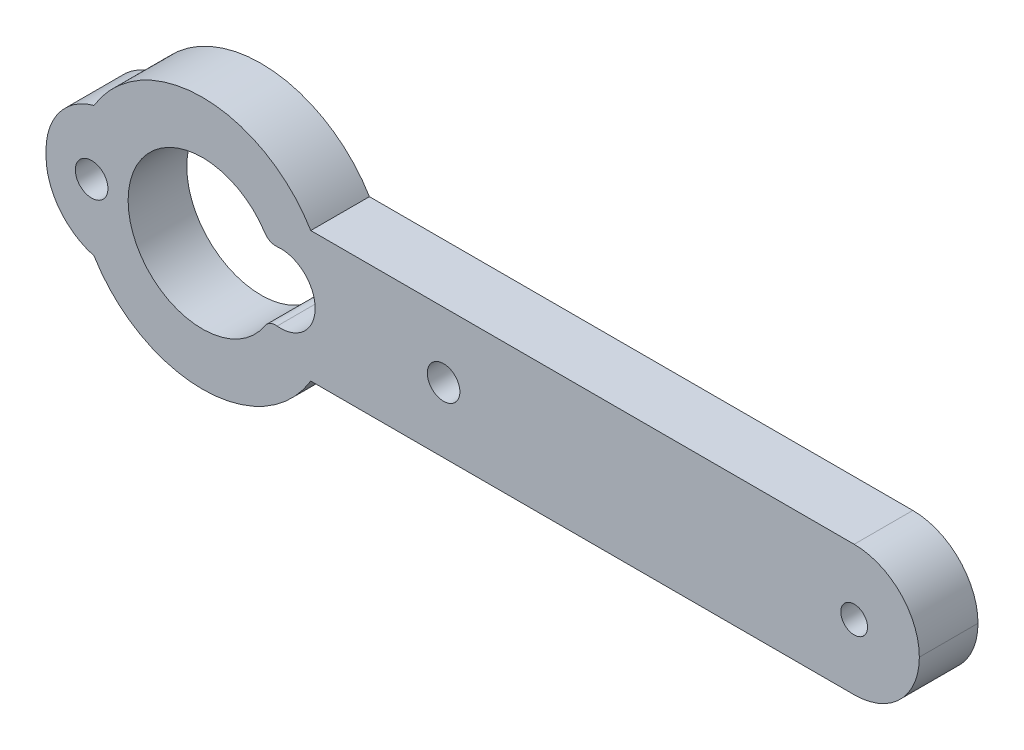
ISO-10303-21;
HEADER;
FILE_DESCRIPTION(('STEP AP214'),'2;1');
FILE_NAME('part.step','',(''),(''),'','','');
FILE_SCHEMA(('AUTOMOTIVE_DESIGN { 1 0 10303 214 1 1 1 1 }'));
ENDSEC;
DATA;
#1=APPLICATION_CONTEXT('core data for automotive mechanical design processes');
#2=APPLICATION_PROTOCOL_DEFINITION('international standard','automotive_design',2000,#1);
#3=PRODUCT_CONTEXT('',#1,'mechanical');
#4=PRODUCT('Part','Part','',(#3));
#5=PRODUCT_RELATED_PRODUCT_CATEGORY('part','',(#4));
#6=PRODUCT_DEFINITION_FORMATION('','',#4);
#7=PRODUCT_DEFINITION_CONTEXT('part definition',#1,'design');
#8=PRODUCT_DEFINITION('design','',#6,#7);
#9=PRODUCT_DEFINITION_SHAPE('','',#8);
#10=(LENGTH_UNIT() NAMED_UNIT(*) SI_UNIT(.MILLI.,.METRE.));
#11=(NAMED_UNIT(*) PLANE_ANGLE_UNIT() SI_UNIT($,.RADIAN.));
#12=(NAMED_UNIT(*) SI_UNIT($,.STERADIAN.) SOLID_ANGLE_UNIT());
#13=UNCERTAINTY_MEASURE_WITH_UNIT(LENGTH_MEASURE(1.E-05),#10,'distance_accuracy_value','');
#14=(GEOMETRIC_REPRESENTATION_CONTEXT(3) GLOBAL_UNCERTAINTY_ASSIGNED_CONTEXT((#13)) GLOBAL_UNIT_ASSIGNED_CONTEXT((#10,
#11,#12)) REPRESENTATION_CONTEXT('',''));
#15=CARTESIAN_POINT('',(0.,0.,0.));
#16=DIRECTION('',(0.,0.,1.));
#17=DIRECTION('',(1.,0.,0.));
#18=AXIS2_PLACEMENT_3D('',#15,#16,#17);
#19=CARTESIAN_POINT('',(-55.,-5.00000000000002,4.5));
#20=DIRECTION('',(0.,0.,1.));
#21=DIRECTION('',(1.,0.,0.));
#22=AXIS2_PLACEMENT_3D('',#19,#20,#21);
#23=PLANE('',#22);
#24=CARTESIAN_POINT('',(-63.5,-5.00000000000002,4.5));
#25=DIRECTION('',(0.,0.,1.));
#26=DIRECTION('',(1.,0.,0.));
#27=AXIS2_PLACEMENT_3D('',#24,#25,#26);
#28=CIRCLE('',#27,1.25);
#29=CARTESIAN_POINT('',(-62.25,-5.00000000000002,4.5));
#30=VERTEX_POINT('',#29);
#31=EDGE_CURVE('E302',#30,#30,#28,.T.);
#32=ORIENTED_EDGE('',*,*,#31,.F.);
#33=EDGE_LOOP('',(#32));
#34=FACE_BOUND('',#33,.T.);
#35=CARTESIAN_POINT('',(-55.,-5.00000000000002,4.5));
#36=DIRECTION('',(0.,0.,1.));
#37=DIRECTION('',(1.,0.,0.));
#38=AXIS2_PLACEMENT_3D('',#35,#36,#37);
#39=CIRCLE('',#38,9.7);
#40=CARTESIAN_POINT('',(-46.6879605390735,0.,4.5));
#41=VERTEX_POINT('',#40);
#42=CARTESIAN_POINT('',(-63.3120394609265,0.,4.5));
#43=VERTEX_POINT('',#42);
#44=EDGE_CURVE('E133',#41,#43,#39,.T.);
#45=ORIENTED_EDGE('',*,*,#44,.T.);
#46=CARTESIAN_POINT('',(-62.,-4.82478522350702,4.5));
#47=DIRECTION('',(0.,0.,1.));
#48=DIRECTION('',(1.,0.,0.));
#49=AXIS2_PLACEMENT_3D('',#46,#47,#48);
#50=CIRCLE('',#49,5.);
#51=CARTESIAN_POINT('',(-67.,-4.82478522350702,4.5));
#52=VERTEX_POINT('',#51);
#53=EDGE_CURVE('E11',#43,#52,#50,.T.);
#54=ORIENTED_EDGE('',*,*,#53,.T.);
#55=DIRECTION('',(0.,-1.,0.));
#56=VECTOR('',#55,1.);
#57=CARTESIAN_POINT('',(-67.,0.,4.5));
#58=LINE('',#57,#56);
#59=CARTESIAN_POINT('',(-67.,-5.17521477649301,4.5));
#60=VERTEX_POINT('',#59);
#61=EDGE_CURVE('E154',#52,#60,#58,.T.);
#62=ORIENTED_EDGE('',*,*,#61,.T.);
#63=CARTESIAN_POINT('',(-62.,-5.17521477649301,4.5));
#64=DIRECTION('',(0.,0.,1.));
#65=DIRECTION('',(1.,0.,0.));
#66=AXIS2_PLACEMENT_3D('',#63,#64,#65);
#67=CIRCLE('',#66,5.);
#68=CARTESIAN_POINT('',(-63.3120394609265,-10.,4.5));
#69=VERTEX_POINT('',#68);
#70=EDGE_CURVE('E45',#60,#69,#67,.T.);
#71=ORIENTED_EDGE('',*,*,#70,.T.);
#72=CARTESIAN_POINT('',(-55.,-5.00000000000002,4.5));
#73=DIRECTION('',(0.,0.,1.));
#74=DIRECTION('',(1.,0.,0.));
#75=AXIS2_PLACEMENT_3D('',#72,#73,#74);
#76=CIRCLE('',#75,9.7);
#77=CARTESIAN_POINT('',(-46.6879605390735,-10.,4.5));
#78=VERTEX_POINT('',#77);
#79=EDGE_CURVE('E156',#69,#78,#76,.T.);
#80=ORIENTED_EDGE('',*,*,#79,.T.);
#81=DIRECTION('',(1.,0.,0.));
#82=VECTOR('',#81,1.);
#83=CARTESIAN_POINT('',(0.,-10.,4.5));
#84=LINE('',#83,#82);
#85=CARTESIAN_POINT('',(-5.,-10.,4.5));
#86=VERTEX_POINT('',#85);
#87=EDGE_CURVE('E161',#78,#86,#84,.T.);
#88=ORIENTED_EDGE('',*,*,#87,.T.);
#89=CARTESIAN_POINT('',(-5.,-5.,4.5));
#90=DIRECTION('',(0.,0.,1.));
#91=DIRECTION('',(1.,0.,0.));
#92=AXIS2_PLACEMENT_3D('',#89,#90,#91);
#93=CIRCLE('',#92,5.);
#94=CARTESIAN_POINT('',(0.,-5.,4.5));
#95=VERTEX_POINT('',#94);
#96=EDGE_CURVE('E206',#86,#95,#93,.T.);
#97=ORIENTED_EDGE('',*,*,#96,.T.);
#98=CARTESIAN_POINT('',(-5.,-5.,4.5));
#99=DIRECTION('',(0.,0.,1.));
#100=DIRECTION('',(1.,0.,0.));
#101=AXIS2_PLACEMENT_3D('',#98,#99,#100);
#102=CIRCLE('',#101,5.);
#103=CARTESIAN_POINT('',(-5.,0.,4.5));
#104=VERTEX_POINT('',#103);
#105=EDGE_CURVE('E136',#95,#104,#102,.T.);
#106=ORIENTED_EDGE('',*,*,#105,.T.);
#107=DIRECTION('',(-1.,0.,0.));
#108=VECTOR('',#107,1.);
#109=CARTESIAN_POINT('',(0.,0.,4.5));
#110=LINE('',#109,#108);
#111=EDGE_CURVE('E129',#104,#41,#110,.T.);
#112=ORIENTED_EDGE('',*,*,#111,.T.);
#113=EDGE_LOOP('',(#45,#54,#62,#71,#80,#88,#97,#106,#112));
#114=FACE_BOUND('',#113,.T.);
#115=CARTESIAN_POINT('',(-5.,-5.00000000000001,4.5));
#116=DIRECTION('',(0.,0.,1.));
#117=DIRECTION('',(1.,0.,0.));
#118=AXIS2_PLACEMENT_3D('',#115,#116,#117);
#119=CIRCLE('',#118,1.025);
#120=CARTESIAN_POINT('',(-3.975,-5.00000000000001,4.5));
#121=VERTEX_POINT('',#120);
#122=EDGE_CURVE('E167',#121,#121,#119,.T.);
#123=ORIENTED_EDGE('',*,*,#122,.F.);
#124=EDGE_LOOP('',(#123));
#125=FACE_BOUND('',#124,.T.);
#126=CARTESIAN_POINT('',(-49.,-5.00000000000001,4.5));
#127=DIRECTION('',(0.,0.,1.));
#128=DIRECTION('',(1.,0.,0.));
#129=AXIS2_PLACEMENT_3D('',#126,#127,#128);
#130=CIRCLE('',#129,2.65);
#131=CARTESIAN_POINT('',(-49.268176369863,-7.63639553835291,4.5));
#132=VERTEX_POINT('',#131);
#133=CARTESIAN_POINT('',(-49.268176369863,-2.36360446164711,4.5));
#134=VERTEX_POINT('',#133);
#135=EDGE_CURVE('E308',#132,#134,#130,.T.);
#136=ORIENTED_EDGE('',*,*,#135,.F.);
#137=CARTESIAN_POINT('',(-49.369375,-8.6312617792408,4.5));
#138=DIRECTION('',(0.,0.,1.));
#139=DIRECTION('',(1.,0.,0.));
#140=AXIS2_PLACEMENT_3D('',#137,#138,#139);
#141=CIRCLE('',#140,1.);
#142=CARTESIAN_POINT('',(-50.2097667910448,-8.08928240920486,4.5));
#143=VERTEX_POINT('',#142);
#144=EDGE_CURVE('E196',#132,#143,#141,.T.);
#145=ORIENTED_EDGE('',*,*,#144,.T.);
#146=CARTESIAN_POINT('',(-55.,-5.00000000000002,4.5));
#147=DIRECTION('',(0.,0.,1.));
#148=DIRECTION('',(1.,0.,0.));
#149=AXIS2_PLACEMENT_3D('',#146,#147,#148);
#150=CIRCLE('',#149,5.7);
#151=CARTESIAN_POINT('',(-50.2097667910448,-1.91071759079516,4.5));
#152=VERTEX_POINT('',#151);
#153=EDGE_CURVE('E311',#152,#143,#150,.T.);
#154=ORIENTED_EDGE('',*,*,#153,.F.);
#155=CARTESIAN_POINT('',(-49.369375,-1.36873822075922,4.5));
#156=DIRECTION('',(0.,0.,1.));
#157=DIRECTION('',(1.,0.,0.));
#158=AXIS2_PLACEMENT_3D('',#155,#156,#157);
#159=CIRCLE('',#158,1.);
#160=EDGE_CURVE('E194',#152,#134,#159,.T.);
#161=ORIENTED_EDGE('',*,*,#160,.T.);
#162=EDGE_LOOP('',(#136,#145,#154,#161));
#163=FACE_BOUND('',#162,.T.);
#164=CARTESIAN_POINT('',(-36.5,-5.00000000000002,4.5));
#165=DIRECTION('',(0.,0.,1.));
#166=DIRECTION('',(1.,0.,0.));
#167=AXIS2_PLACEMENT_3D('',#164,#165,#166);
#168=CIRCLE('',#167,1.25);
#169=CARTESIAN_POINT('',(-35.25,-5.00000000000002,4.5));
#170=VERTEX_POINT('',#169);
#171=EDGE_CURVE('E294',#170,#170,#168,.T.);
#172=ORIENTED_EDGE('',*,*,#171,.F.);
#173=EDGE_LOOP('',(#172));
#174=FACE_BOUND('',#173,.T.);
#175=ADVANCED_FACE('F37',(#34,#114,#125,#163,#174),#23,.T.);
#176=CARTESIAN_POINT('',(-55.,-5.00000000000002,0.));
#177=DIRECTION('',(0.,0.,1.));
#178=DIRECTION('',(1.,0.,0.));
#179=AXIS2_PLACEMENT_3D('',#176,#177,#178);
#180=PLANE('',#179);
#181=CARTESIAN_POINT('',(-5.,-5.00000000000001,0.));
#182=DIRECTION('',(0.,0.,1.));
#183=DIRECTION('',(1.,0.,0.));
#184=AXIS2_PLACEMENT_3D('',#181,#182,#183);
#185=CIRCLE('',#184,1.025);
#186=CARTESIAN_POINT('',(-3.975,-5.00000000000001,0.));
#187=VERTEX_POINT('',#186);
#188=EDGE_CURVE('E315',#187,#187,#185,.T.);
#189=ORIENTED_EDGE('',*,*,#188,.T.);
#190=EDGE_LOOP('',(#189));
#191=FACE_BOUND('',#190,.T.);
#192=DIRECTION('',(0.,-1.,0.));
#193=VECTOR('',#192,1.);
#194=CARTESIAN_POINT('',(-67.,0.,0.));
#195=LINE('',#194,#193);
#196=CARTESIAN_POINT('',(-67.,-4.82478522350702,0.));
#197=VERTEX_POINT('',#196);
#198=CARTESIAN_POINT('',(-67.,-5.17521477649301,0.));
#199=VERTEX_POINT('',#198);
#200=EDGE_CURVE('E169',#197,#199,#195,.T.);
#201=ORIENTED_EDGE('',*,*,#200,.F.);
#202=CARTESIAN_POINT('',(-62.,-4.82478522350702,0.));
#203=DIRECTION('',(0.,0.,1.));
#204=DIRECTION('',(1.,0.,0.));
#205=AXIS2_PLACEMENT_3D('',#202,#203,#204);
#206=CIRCLE('',#205,5.);
#207=CARTESIAN_POINT('',(-63.3120394609265,0.,0.));
#208=VERTEX_POINT('',#207);
#209=EDGE_CURVE('E220',#197,#208,#206,.F.);
#210=ORIENTED_EDGE('',*,*,#209,.T.);
#211=CARTESIAN_POINT('',(-55.,-5.00000000000002,0.));
#212=DIRECTION('',(0.,0.,1.));
#213=DIRECTION('',(1.,0.,0.));
#214=AXIS2_PLACEMENT_3D('',#211,#212,#213);
#215=CIRCLE('',#214,9.7);
#216=CARTESIAN_POINT('',(-46.6879605390735,0.,0.));
#217=VERTEX_POINT('',#216);
#218=EDGE_CURVE('E166',#217,#208,#215,.T.);
#219=ORIENTED_EDGE('',*,*,#218,.F.);
#220=DIRECTION('',(-1.,0.,0.));
#221=VECTOR('',#220,1.);
#222=CARTESIAN_POINT('',(0.,0.,0.));
#223=LINE('',#222,#221);
#224=CARTESIAN_POINT('',(-5.,0.,0.));
#225=VERTEX_POINT('',#224);
#226=EDGE_CURVE('E145',#225,#217,#223,.T.);
#227=ORIENTED_EDGE('',*,*,#226,.F.);
#228=CARTESIAN_POINT('',(-5.,-5.,0.));
#229=DIRECTION('',(0.,0.,1.));
#230=DIRECTION('',(1.,0.,0.));
#231=AXIS2_PLACEMENT_3D('',#228,#229,#230);
#232=CIRCLE('',#231,5.);
#233=CARTESIAN_POINT('',(0.,-5.,0.));
#234=VERTEX_POINT('',#233);
#235=EDGE_CURVE('E198',#225,#234,#232,.F.);
#236=ORIENTED_EDGE('',*,*,#235,.T.);
#237=CARTESIAN_POINT('',(-5.,-5.,0.));
#238=DIRECTION('',(0.,0.,1.));
#239=DIRECTION('',(1.,0.,0.));
#240=AXIS2_PLACEMENT_3D('',#237,#238,#239);
#241=CIRCLE('',#240,5.);
#242=CARTESIAN_POINT('',(-5.,-10.,0.));
#243=VERTEX_POINT('',#242);
#244=EDGE_CURVE('E200',#234,#243,#241,.F.);
#245=ORIENTED_EDGE('',*,*,#244,.T.);
#246=DIRECTION('',(1.,0.,0.));
#247=VECTOR('',#246,1.);
#248=CARTESIAN_POINT('',(0.,-10.,0.));
#249=LINE('',#248,#247);
#250=CARTESIAN_POINT('',(-46.6879605390735,-10.,0.));
#251=VERTEX_POINT('',#250);
#252=EDGE_CURVE('E139',#251,#243,#249,.T.);
#253=ORIENTED_EDGE('',*,*,#252,.F.);
#254=CARTESIAN_POINT('',(-55.,-5.00000000000002,0.));
#255=DIRECTION('',(0.,0.,1.));
#256=DIRECTION('',(1.,0.,0.));
#257=AXIS2_PLACEMENT_3D('',#254,#255,#256);
#258=CIRCLE('',#257,9.7);
#259=CARTESIAN_POINT('',(-63.3120394609265,-10.,0.));
#260=VERTEX_POINT('',#259);
#261=EDGE_CURVE('E171',#260,#251,#258,.T.);
#262=ORIENTED_EDGE('',*,*,#261,.F.);
#263=CARTESIAN_POINT('',(-62.,-5.17521477649301,0.));
#264=DIRECTION('',(0.,0.,1.));
#265=DIRECTION('',(1.,0.,0.));
#266=AXIS2_PLACEMENT_3D('',#263,#264,#265);
#267=CIRCLE('',#266,5.);
#268=EDGE_CURVE('E218',#260,#199,#267,.F.);
#269=ORIENTED_EDGE('',*,*,#268,.T.);
#270=EDGE_LOOP('',(#201,#210,#219,#227,#236,#245,#253,#262,#269));
#271=FACE_BOUND('',#270,.T.);
#272=CARTESIAN_POINT('',(-55.,-5.00000000000002,0.));
#273=DIRECTION('',(0.,0.,1.));
#274=DIRECTION('',(1.,0.,0.));
#275=AXIS2_PLACEMENT_3D('',#272,#273,#274);
#276=CIRCLE('',#275,5.7);
#277=CARTESIAN_POINT('',(-50.2097667910448,-1.91071759079516,0.));
#278=VERTEX_POINT('',#277);
#279=CARTESIAN_POINT('',(-50.2097667910448,-8.08928240920486,0.));
#280=VERTEX_POINT('',#279);
#281=EDGE_CURVE('E312',#278,#280,#276,.T.);
#282=ORIENTED_EDGE('',*,*,#281,.T.);
#283=CARTESIAN_POINT('',(-49.369375,-8.6312617792408,0.));
#284=DIRECTION('',(0.,0.,1.));
#285=DIRECTION('',(1.,0.,0.));
#286=AXIS2_PLACEMENT_3D('',#283,#284,#285);
#287=CIRCLE('',#286,1.);
#288=CARTESIAN_POINT('',(-49.268176369863,-7.63639553835291,0.));
#289=VERTEX_POINT('',#288);
#290=EDGE_CURVE('E187',#280,#289,#287,.F.);
#291=ORIENTED_EDGE('',*,*,#290,.T.);
#292=CARTESIAN_POINT('',(-49.,-5.00000000000001,0.));
#293=DIRECTION('',(0.,0.,1.));
#294=DIRECTION('',(1.,0.,0.));
#295=AXIS2_PLACEMENT_3D('',#292,#293,#294);
#296=CIRCLE('',#295,2.65);
#297=CARTESIAN_POINT('',(-49.268176369863,-2.36360446164711,0.));
#298=VERTEX_POINT('',#297);
#299=EDGE_CURVE('E305',#289,#298,#296,.T.);
#300=ORIENTED_EDGE('',*,*,#299,.T.);
#301=CARTESIAN_POINT('',(-49.369375,-1.36873822075922,0.));
#302=DIRECTION('',(0.,0.,1.));
#303=DIRECTION('',(1.,0.,0.));
#304=AXIS2_PLACEMENT_3D('',#301,#302,#303);
#305=CIRCLE('',#304,1.);
#306=EDGE_CURVE('E185',#298,#278,#305,.F.);
#307=ORIENTED_EDGE('',*,*,#306,.T.);
#308=EDGE_LOOP('',(#282,#291,#300,#307));
#309=FACE_BOUND('',#308,.T.);
#310=CARTESIAN_POINT('',(-63.5,-5.00000000000002,0.));
#311=DIRECTION('',(0.,0.,1.));
#312=DIRECTION('',(1.,0.,0.));
#313=AXIS2_PLACEMENT_3D('',#310,#311,#312);
#314=CIRCLE('',#313,1.25);
#315=CARTESIAN_POINT('',(-62.25,-5.00000000000002,0.));
#316=VERTEX_POINT('',#315);
#317=EDGE_CURVE('E299',#316,#316,#314,.T.);
#318=ORIENTED_EDGE('',*,*,#317,.T.);
#319=EDGE_LOOP('',(#318));
#320=FACE_BOUND('',#319,.T.);
#321=CARTESIAN_POINT('',(-36.5,-5.00000000000002,0.));
#322=DIRECTION('',(0.,0.,1.));
#323=DIRECTION('',(1.,0.,0.));
#324=AXIS2_PLACEMENT_3D('',#321,#322,#323);
#325=CIRCLE('',#324,1.25);
#326=CARTESIAN_POINT('',(-35.25,-5.00000000000002,0.));
#327=VERTEX_POINT('',#326);
#328=EDGE_CURVE('E213',#327,#327,#325,.T.);
#329=ORIENTED_EDGE('',*,*,#328,.T.);
#330=EDGE_LOOP('',(#329));
#331=FACE_BOUND('',#330,.T.);
#332=ADVANCED_FACE('F232',(#191,#271,#309,#320,#331),#180,.F.);
#333=CARTESIAN_POINT('',(0.,0.,4.5));
#334=DIRECTION('',(0.,-1.,0.));
#335=DIRECTION('',(1.,0.,0.));
#336=AXIS2_PLACEMENT_3D('',#333,#334,#335);
#337=PLANE('',#336);
#338=ORIENTED_EDGE('',*,*,#111,.F.);
#339=DIRECTION('',(0.,0.,-1.));
#340=VECTOR('',#339,1.);
#341=CARTESIAN_POINT('',(-5.,0.,4.5));
#342=LINE('',#341,#340);
#343=EDGE_CURVE('E208',#104,#225,#342,.T.);
#344=ORIENTED_EDGE('',*,*,#343,.T.);
#345=ORIENTED_EDGE('',*,*,#226,.T.);
#346=DIRECTION('',(0.,0.,-1.));
#347=VECTOR('',#346,1.);
#348=CARTESIAN_POINT('',(-46.6879605390735,0.,4.5));
#349=LINE('',#348,#347);
#350=EDGE_CURVE('E142',#41,#217,#349,.T.);
#351=ORIENTED_EDGE('',*,*,#350,.F.);
#352=EDGE_LOOP('',(#338,#344,#345,#351));
#353=FACE_BOUND('',#352,.T.);
#354=ADVANCED_FACE('F143',(#353),#337,.F.);
#355=CARTESIAN_POINT('',(-55.,-5.00000000000002,4.5));
#356=DIRECTION('',(0.,0.,-1.));
#357=DIRECTION('',(-1.,0.,0.));
#358=AXIS2_PLACEMENT_3D('',#355,#356,#357);
#359=CYLINDRICAL_SURFACE('',#358,9.7);
#360=ORIENTED_EDGE('',*,*,#218,.T.);
#361=DIRECTION('',(0.,0.,-1.));
#362=VECTOR('',#361,1.);
#363=CARTESIAN_POINT('',(-63.3120394609265,0.,4.5));
#364=LINE('',#363,#362);
#365=EDGE_CURVE('E150',#43,#208,#364,.T.);
#366=ORIENTED_EDGE('',*,*,#365,.F.);
#367=ORIENTED_EDGE('',*,*,#44,.F.);
#368=ORIENTED_EDGE('',*,*,#350,.T.);
#369=EDGE_LOOP('',(#360,#366,#367,#368));
#370=FACE_BOUND('',#369,.T.);
#371=ADVANCED_FACE('F152',(#370),#359,.T.);
#372=CARTESIAN_POINT('',(-67.,0.,4.5));
#373=DIRECTION('',(1.,0.,0.));
#374=DIRECTION('',(0.,0.,-1.));
#375=AXIS2_PLACEMENT_3D('',#372,#373,#374);
#376=PLANE('',#375);
#377=ORIENTED_EDGE('',*,*,#61,.F.);
#378=DIRECTION('',(0.,0.,-1.));
#379=VECTOR('',#378,1.);
#380=CARTESIAN_POINT('',(-67.,-4.82478522350702,4.5));
#381=LINE('',#380,#379);
#382=EDGE_CURVE('E215',#52,#197,#381,.T.);
#383=ORIENTED_EDGE('',*,*,#382,.T.);
#384=ORIENTED_EDGE('',*,*,#200,.T.);
#385=DIRECTION('',(0.,0.,-1.));
#386=VECTOR('',#385,1.);
#387=CARTESIAN_POINT('',(-67.,-5.17521477649301,4.5));
#388=LINE('',#387,#386);
#389=EDGE_CURVE('E52',#199,#60,#388,.F.);
#390=ORIENTED_EDGE('',*,*,#389,.T.);
#391=EDGE_LOOP('',(#377,#383,#384,#390));
#392=FACE_BOUND('',#391,.T.);
#393=ADVANCED_FACE('F235',(#392),#376,.F.);
#394=CARTESIAN_POINT('',(-55.,-5.00000000000002,4.5));
#395=DIRECTION('',(0.,0.,-1.));
#396=DIRECTION('',(-1.,0.,0.));
#397=AXIS2_PLACEMENT_3D('',#394,#395,#396);
#398=CYLINDRICAL_SURFACE('',#397,9.7);
#399=ORIENTED_EDGE('',*,*,#261,.T.);
#400=DIRECTION('',(0.,0.,-1.));
#401=VECTOR('',#400,1.);
#402=CARTESIAN_POINT('',(-46.6879605390735,-10.,4.5));
#403=LINE('',#402,#401);
#404=EDGE_CURVE('E164',#78,#251,#403,.T.);
#405=ORIENTED_EDGE('',*,*,#404,.F.);
#406=ORIENTED_EDGE('',*,*,#79,.F.);
#407=DIRECTION('',(0.,0.,-1.));
#408=VECTOR('',#407,1.);
#409=CARTESIAN_POINT('',(-63.3120394609265,-10.,4.5));
#410=LINE('',#409,#408);
#411=EDGE_CURVE('E177',#69,#260,#410,.T.);
#412=ORIENTED_EDGE('',*,*,#411,.T.);
#413=EDGE_LOOP('',(#399,#405,#406,#412));
#414=FACE_BOUND('',#413,.T.);
#415=ADVANCED_FACE('F227',(#414),#398,.T.);
#416=CARTESIAN_POINT('',(0.,-10.,4.5));
#417=DIRECTION('',(0.,1.,0.));
#418=DIRECTION('',(-1.,0.,0.));
#419=AXIS2_PLACEMENT_3D('',#416,#417,#418);
#420=PLANE('',#419);
#421=ORIENTED_EDGE('',*,*,#252,.T.);
#422=DIRECTION('',(0.,0.,-1.));
#423=VECTOR('',#422,1.);
#424=CARTESIAN_POINT('',(-5.,-10.,4.5));
#425=LINE('',#424,#423);
#426=EDGE_CURVE('E202',#243,#86,#425,.F.);
#427=ORIENTED_EDGE('',*,*,#426,.T.);
#428=ORIENTED_EDGE('',*,*,#87,.F.);
#429=ORIENTED_EDGE('',*,*,#404,.T.);
#430=EDGE_LOOP('',(#421,#427,#428,#429));
#431=FACE_BOUND('',#430,.T.);
#432=ADVANCED_FACE('F248',(#431),#420,.F.);
#433=CARTESIAN_POINT('',(-5.,-5.00000000000001,4.5));
#434=DIRECTION('',(0.,0.,-1.));
#435=DIRECTION('',(-1.,0.,0.));
#436=AXIS2_PLACEMENT_3D('',#433,#434,#435);
#437=CYLINDRICAL_SURFACE('',#436,1.025);
#438=ORIENTED_EDGE('',*,*,#122,.T.);
#439=EDGE_LOOP('',(#438));
#440=FACE_BOUND('',#439,.T.);
#441=ORIENTED_EDGE('',*,*,#188,.F.);
#442=EDGE_LOOP('',(#441));
#443=FACE_BOUND('',#442,.T.);
#444=ADVANCED_FACE('F250',(#440,#443),#437,.F.);
#445=CARTESIAN_POINT('',(-49.,-5.00000000000001,4.5));
#446=DIRECTION('',(0.,0.,-1.));
#447=DIRECTION('',(-1.,0.,0.));
#448=AXIS2_PLACEMENT_3D('',#445,#446,#447);
#449=CYLINDRICAL_SURFACE('',#448,2.65);
#450=ORIENTED_EDGE('',*,*,#299,.F.);
#451=DIRECTION('',(0.,0.,-1.));
#452=VECTOR('',#451,1.);
#453=CARTESIAN_POINT('',(-49.268176369863,-7.63639553835291,4.5));
#454=LINE('',#453,#452);
#455=EDGE_CURVE('E192',#289,#132,#454,.F.);
#456=ORIENTED_EDGE('',*,*,#455,.T.);
#457=ORIENTED_EDGE('',*,*,#135,.T.);
#458=DIRECTION('',(0.,0.,-1.));
#459=VECTOR('',#458,1.);
#460=CARTESIAN_POINT('',(-49.268176369863,-2.36360446164711,4.5));
#461=LINE('',#460,#459);
#462=EDGE_CURVE('E189',#134,#298,#461,.T.);
#463=ORIENTED_EDGE('',*,*,#462,.T.);
#464=EDGE_LOOP('',(#450,#456,#457,#463));
#465=FACE_BOUND('',#464,.T.);
#466=ADVANCED_FACE('F256',(#465),#449,.F.);
#467=CARTESIAN_POINT('',(-55.,-5.00000000000002,4.5));
#468=DIRECTION('',(0.,0.,-1.));
#469=DIRECTION('',(-1.,0.,0.));
#470=AXIS2_PLACEMENT_3D('',#467,#468,#469);
#471=CYLINDRICAL_SURFACE('',#470,5.7);
#472=ORIENTED_EDGE('',*,*,#153,.T.);
#473=DIRECTION('',(0.,0.,-1.));
#474=VECTOR('',#473,1.);
#475=CARTESIAN_POINT('',(-50.2097667910448,-8.08928240920486,4.5));
#476=LINE('',#475,#474);
#477=EDGE_CURVE('E182',#143,#280,#476,.T.);
#478=ORIENTED_EDGE('',*,*,#477,.T.);
#479=ORIENTED_EDGE('',*,*,#281,.F.);
#480=DIRECTION('',(0.,0.,-1.));
#481=VECTOR('',#480,1.);
#482=CARTESIAN_POINT('',(-50.2097667910448,-1.91071759079516,4.5));
#483=LINE('',#482,#481);
#484=EDGE_CURVE('E149',#278,#152,#483,.F.);
#485=ORIENTED_EDGE('',*,*,#484,.T.);
#486=EDGE_LOOP('',(#472,#478,#479,#485));
#487=FACE_BOUND('',#486,.T.);
#488=ADVANCED_FACE('F272',(#487),#471,.F.);
#489=CARTESIAN_POINT('',(-63.5,-5.00000000000002,4.5));
#490=DIRECTION('',(0.,0.,-1.));
#491=DIRECTION('',(-1.,0.,0.));
#492=AXIS2_PLACEMENT_3D('',#489,#490,#491);
#493=CYLINDRICAL_SURFACE('',#492,1.25);
#494=ORIENTED_EDGE('',*,*,#31,.T.);
#495=EDGE_LOOP('',(#494));
#496=FACE_BOUND('',#495,.T.);
#497=ORIENTED_EDGE('',*,*,#317,.F.);
#498=EDGE_LOOP('',(#497));
#499=FACE_BOUND('',#498,.T.);
#500=ADVANCED_FACE('F276',(#496,#499),#493,.F.);
#501=CARTESIAN_POINT('',(-36.5,-5.00000000000002,4.5));
#502=DIRECTION('',(0.,0.,-1.));
#503=DIRECTION('',(-1.,0.,0.));
#504=AXIS2_PLACEMENT_3D('',#501,#502,#503);
#505=CYLINDRICAL_SURFACE('',#504,1.25);
#506=ORIENTED_EDGE('',*,*,#171,.T.);
#507=EDGE_LOOP('',(#506));
#508=FACE_BOUND('',#507,.T.);
#509=ORIENTED_EDGE('',*,*,#328,.F.);
#510=EDGE_LOOP('',(#509));
#511=FACE_BOUND('',#510,.T.);
#512=ADVANCED_FACE('F280',(#508,#511),#505,.F.);
#513=CARTESIAN_POINT('',(-49.369375,-8.6312617792408,4.5));
#514=DIRECTION('',(0.,0.,-1.));
#515=DIRECTION('',(-1.,0.,0.));
#516=AXIS2_PLACEMENT_3D('',#513,#514,#515);
#517=CYLINDRICAL_SURFACE('',#516,1.);
#518=ORIENTED_EDGE('',*,*,#144,.F.);
#519=ORIENTED_EDGE('',*,*,#455,.F.);
#520=ORIENTED_EDGE('',*,*,#290,.F.);
#521=ORIENTED_EDGE('',*,*,#477,.F.);
#522=EDGE_LOOP('',(#518,#519,#520,#521));
#523=FACE_BOUND('',#522,.T.);
#524=ADVANCED_FACE('F283',(#523),#517,.T.);
#525=CARTESIAN_POINT('',(-49.369375,-1.36873822075922,4.5));
#526=DIRECTION('',(0.,0.,-1.));
#527=DIRECTION('',(-1.,0.,0.));
#528=AXIS2_PLACEMENT_3D('',#525,#526,#527);
#529=CYLINDRICAL_SURFACE('',#528,1.);
#530=ORIENTED_EDGE('',*,*,#160,.F.);
#531=ORIENTED_EDGE('',*,*,#484,.F.);
#532=ORIENTED_EDGE('',*,*,#306,.F.);
#533=ORIENTED_EDGE('',*,*,#462,.F.);
#534=EDGE_LOOP('',(#530,#531,#532,#533));
#535=FACE_BOUND('',#534,.T.);
#536=ADVANCED_FACE('F288',(#535),#529,.T.);
#537=CARTESIAN_POINT('',(-5.,-5.,4.5));
#538=DIRECTION('',(0.,0.,-1.));
#539=DIRECTION('',(-1.,0.,0.));
#540=AXIS2_PLACEMENT_3D('',#537,#538,#539);
#541=CYLINDRICAL_SURFACE('',#540,5.);
#542=ORIENTED_EDGE('',*,*,#343,.F.);
#543=ORIENTED_EDGE('',*,*,#105,.F.);
#544=DIRECTION('',(0.,0.,-1.));
#545=VECTOR('',#544,1.);
#546=CARTESIAN_POINT('',(0.,-5.,4.5));
#547=LINE('',#546,#545);
#548=EDGE_CURVE('E210',#234,#95,#547,.F.);
#549=ORIENTED_EDGE('',*,*,#548,.F.);
#550=ORIENTED_EDGE('',*,*,#235,.F.);
#551=EDGE_LOOP('',(#542,#543,#549,#550));
#552=FACE_BOUND('',#551,.T.);
#553=ADVANCED_FACE('F242',(#552),#541,.T.);
#554=CARTESIAN_POINT('',(-5.,-5.,4.5));
#555=DIRECTION('',(0.,0.,-1.));
#556=DIRECTION('',(-1.,0.,0.));
#557=AXIS2_PLACEMENT_3D('',#554,#555,#556);
#558=CYLINDRICAL_SURFACE('',#557,5.);
#559=ORIENTED_EDGE('',*,*,#96,.F.);
#560=ORIENTED_EDGE('',*,*,#426,.F.);
#561=ORIENTED_EDGE('',*,*,#244,.F.);
#562=ORIENTED_EDGE('',*,*,#548,.T.);
#563=EDGE_LOOP('',(#559,#560,#561,#562));
#564=FACE_BOUND('',#563,.T.);
#565=ADVANCED_FACE('F246',(#564),#558,.T.);
#566=CARTESIAN_POINT('',(-62.,-4.82478522350702,4.5));
#567=DIRECTION('',(0.,0.,-1.));
#568=DIRECTION('',(-1.,0.,0.));
#569=AXIS2_PLACEMENT_3D('',#566,#567,#568);
#570=CYLINDRICAL_SURFACE('',#569,5.);
#571=ORIENTED_EDGE('',*,*,#53,.F.);
#572=ORIENTED_EDGE('',*,*,#365,.T.);
#573=ORIENTED_EDGE('',*,*,#209,.F.);
#574=ORIENTED_EDGE('',*,*,#382,.F.);
#575=EDGE_LOOP('',(#571,#572,#573,#574));
#576=FACE_BOUND('',#575,.T.);
#577=ADVANCED_FACE('F238',(#576),#570,.T.);
#578=CARTESIAN_POINT('',(-62.,-5.17521477649301,4.5));
#579=DIRECTION('',(0.,0.,-1.));
#580=DIRECTION('',(-1.,0.,0.));
#581=AXIS2_PLACEMENT_3D('',#578,#579,#580);
#582=CYLINDRICAL_SURFACE('',#581,5.);
#583=ORIENTED_EDGE('',*,*,#70,.F.);
#584=ORIENTED_EDGE('',*,*,#389,.F.);
#585=ORIENTED_EDGE('',*,*,#268,.F.);
#586=ORIENTED_EDGE('',*,*,#411,.F.);
#587=EDGE_LOOP('',(#583,#584,#585,#586));
#588=FACE_BOUND('',#587,.T.);
#589=ADVANCED_FACE('F39',(#588),#582,.T.);
#590=CLOSED_SHELL('',(#175,#332,#354,#371,#393,#415,#432,#444,#466,#488,#500,#512,#524,#536,
#553,#565,#577,#589));
#591=MANIFOLD_SOLID_BREP('B2',#590);
#592=ADVANCED_BREP_SHAPE_REPRESENTATION('',(#18,#591),#14);
#593=SHAPE_DEFINITION_REPRESENTATION(#9,#592);
ENDSEC;
END-ISO-10303-21;
